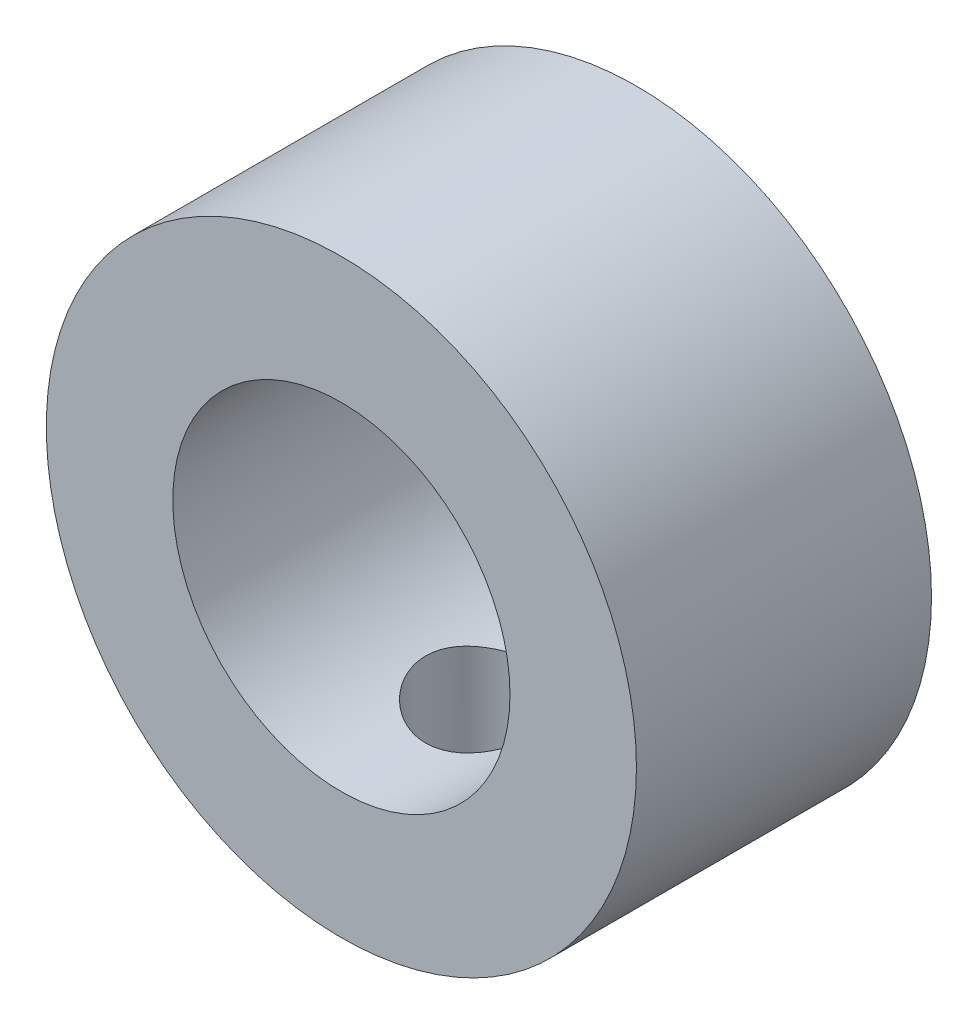
ISO-10303-21;
HEADER;
FILE_DESCRIPTION(('STEP AP214'),'2;1');
FILE_NAME('part.step','',(''),(''),'','','');
FILE_SCHEMA(('AUTOMOTIVE_DESIGN { 1 0 10303 214 1 1 1 1 }'));
ENDSEC;
DATA;
#1=APPLICATION_CONTEXT('core data for automotive mechanical design processes');
#2=APPLICATION_PROTOCOL_DEFINITION('international standard','automotive_design',2000,#1);
#3=PRODUCT_CONTEXT('',#1,'mechanical');
#4=PRODUCT('Part','Part','',(#3));
#5=PRODUCT_RELATED_PRODUCT_CATEGORY('part','',(#4));
#6=PRODUCT_DEFINITION_FORMATION('','',#4);
#7=PRODUCT_DEFINITION_CONTEXT('part definition',#1,'design');
#8=PRODUCT_DEFINITION('design','',#6,#7);
#9=PRODUCT_DEFINITION_SHAPE('','',#8);
#10=(LENGTH_UNIT() NAMED_UNIT(*) SI_UNIT(.MILLI.,.METRE.));
#11=(NAMED_UNIT(*) PLANE_ANGLE_UNIT() SI_UNIT($,.RADIAN.));
#12=(NAMED_UNIT(*) SI_UNIT($,.STERADIAN.) SOLID_ANGLE_UNIT());
#13=UNCERTAINTY_MEASURE_WITH_UNIT(LENGTH_MEASURE(1.E-05),#10,'distance_accuracy_value','');
#14=(GEOMETRIC_REPRESENTATION_CONTEXT(3) GLOBAL_UNCERTAINTY_ASSIGNED_CONTEXT((#13)) GLOBAL_UNIT_ASSIGNED_CONTEXT((#10,
#11,#12)) REPRESENTATION_CONTEXT('',''));
#15=CARTESIAN_POINT('',(0.,0.,0.));
#16=DIRECTION('',(0.,0.,1.));
#17=DIRECTION('',(1.,0.,0.));
#18=AXIS2_PLACEMENT_3D('',#15,#16,#17);
#19=CARTESIAN_POINT('',(0.,0.,7.));
#20=DIRECTION('',(0.,0.,1.));
#21=DIRECTION('',(1.,0.,0.));
#22=AXIS2_PLACEMENT_3D('',#19,#20,#21);
#23=PLANE('',#22);
#24=CARTESIAN_POINT('',(0.,0.,7.));
#25=DIRECTION('',(0.,0.,1.));
#26=DIRECTION('',(1.,0.,0.));
#27=AXIS2_PLACEMENT_3D('',#24,#25,#26);
#28=CIRCLE('',#27,7.);
#29=CARTESIAN_POINT('',(7.,0.,7.));
#30=VERTEX_POINT('',#29);
#31=EDGE_CURVE('E10',#30,#30,#28,.T.);
#32=ORIENTED_EDGE('',*,*,#31,.T.);
#33=EDGE_LOOP('',(#32));
#34=FACE_BOUND('',#33,.T.);
#35=CARTESIAN_POINT('',(0.,0.,7.));
#36=DIRECTION('',(0.,0.,1.));
#37=DIRECTION('',(1.,0.,0.));
#38=AXIS2_PLACEMENT_3D('',#35,#36,#37);
#39=CIRCLE('',#38,4.);
#40=CARTESIAN_POINT('',(4.,0.,7.));
#41=VERTEX_POINT('',#40);
#42=EDGE_CURVE('E48',#41,#41,#39,.T.);
#43=ORIENTED_EDGE('',*,*,#42,.F.);
#44=EDGE_LOOP('',(#43));
#45=FACE_BOUND('',#44,.T.);
#46=ADVANCED_FACE('F31',(#34,#45),#23,.T.);
#47=CARTESIAN_POINT('',(0.,0.,0.));
#48=DIRECTION('',(0.,0.,1.));
#49=DIRECTION('',(1.,0.,0.));
#50=AXIS2_PLACEMENT_3D('',#47,#48,#49);
#51=PLANE('',#50);
#52=CARTESIAN_POINT('',(0.,0.,0.));
#53=DIRECTION('',(0.,0.,1.));
#54=DIRECTION('',(1.,0.,0.));
#55=AXIS2_PLACEMENT_3D('',#52,#53,#54);
#56=CIRCLE('',#55,7.);
#57=CARTESIAN_POINT('',(7.,0.,0.));
#58=VERTEX_POINT('',#57);
#59=EDGE_CURVE('E43',#58,#58,#56,.T.);
#60=ORIENTED_EDGE('',*,*,#59,.F.);
#61=EDGE_LOOP('',(#60));
#62=FACE_BOUND('',#61,.T.);
#63=CARTESIAN_POINT('',(0.,0.,0.));
#64=DIRECTION('',(0.,0.,1.));
#65=DIRECTION('',(1.,0.,0.));
#66=AXIS2_PLACEMENT_3D('',#63,#64,#65);
#67=CIRCLE('',#66,4.);
#68=CARTESIAN_POINT('',(4.,0.,0.));
#69=VERTEX_POINT('',#68);
#70=EDGE_CURVE('E50',#69,#69,#67,.T.);
#71=ORIENTED_EDGE('',*,*,#70,.T.);
#72=EDGE_LOOP('',(#71));
#73=FACE_BOUND('',#72,.T.);
#74=ADVANCED_FACE('F69',(#62,#73),#51,.F.);
#75=CARTESIAN_POINT('',(0.,0.,7.));
#76=DIRECTION('',(0.,0.,-1.));
#77=DIRECTION('',(-1.,0.,0.));
#78=AXIS2_PLACEMENT_3D('',#75,#76,#77);
#79=CYLINDRICAL_SURFACE('',#78,7.);
#80=CARTESIAN_POINT('',(0.,-7.,5.));
#81=CARTESIAN_POINT('',(-0.0832358860906165,-6.99999846043226,4.9999971004257));
#82=CARTESIAN_POINT('',(-0.166507195600274,-6.9985002594971,4.99304839161214));
#83=CARTESIAN_POINT('',(-0.330687344293327,-6.99266829827728,4.96546434314641));
#84=CARTESIAN_POINT('',(-0.41159440357119,-6.98833245637099,4.94481895580507));
#85=CARTESIAN_POINT('',(-0.568649323817736,-6.97730831788827,4.89051563539196));
#86=CARTESIAN_POINT('',(-0.644801963446555,-6.97062242967171,4.85687102061868));
#87=CARTESIAN_POINT('',(-0.790378177960787,-6.95562106817971,4.77756591382874));
#88=CARTESIAN_POINT('',(-0.859801981747369,-6.94730565036661,4.73190583075006));
#89=CARTESIAN_POINT('',(-0.991024790535229,-6.92981369246311,4.62911970032649));
#90=CARTESIAN_POINT('',(-1.05270503419445,-6.92062683143259,4.57184377810147));
#91=CARTESIAN_POINT('',(-1.16566042389435,-6.90250069814144,4.4477736843148));
#92=CARTESIAN_POINT('',(-1.21693467150908,-6.8935614473163,4.38097869174874));
#93=CARTESIAN_POINT('',(-1.30814204379808,-6.87684116047225,4.23889424713957));
#94=CARTESIAN_POINT('',(-1.34794958335009,-6.8690733634436,4.16352248224379));
#95=CARTESIAN_POINT('',(-1.41428823691148,-6.85572325558537,4.00696554623316));
#96=CARTESIAN_POINT('',(-1.44082087001716,-6.85014069470711,3.92578104150743));
#97=CARTESIAN_POINT('',(-1.47946574422454,-6.84189808926311,3.76118891341193));
#98=CARTESIAN_POINT('',(-1.49178779748342,-6.83919556896486,3.67783272433614));
#99=CARTESIAN_POINT('',(-1.50231395206577,-6.83689139845106,3.51019576749301));
#100=CARTESIAN_POINT('',(-1.50051971664629,-6.83728938291729,3.42591510982005));
#101=CARTESIAN_POINT('',(-1.48303326340861,-6.84110276603832,3.26037531206621));
#102=CARTESIAN_POINT('',(-1.46758398649408,-6.84446541682162,3.17908911089985));
#103=CARTESIAN_POINT('',(-1.42361054298677,-6.85374593375788,3.02028975971066));
#104=CARTESIAN_POINT('',(-1.39508566936466,-6.85966393808402,2.94277681396768));
#105=CARTESIAN_POINT('',(-1.32554551075991,-6.87344080755724,2.79303712712666));
#106=CARTESIAN_POINT('',(-1.2844361097283,-6.88131420983365,2.72085548728745));
#107=CARTESIAN_POINT('',(-1.19096007283993,-6.89810572501288,2.58432483504204));
#108=CARTESIAN_POINT('',(-1.13859196103562,-6.90702397481896,2.5199768513138));
#109=CARTESIAN_POINT('',(-1.0227954275532,-6.92512718393878,2.3995406443266));
#110=CARTESIAN_POINT('',(-0.959160233964411,-6.93431383972178,2.34365129341526));
#111=CARTESIAN_POINT('',(-0.823317306269097,-6.95175017497059,2.24330626631034));
#112=CARTESIAN_POINT('',(-0.7511094287754,-6.95999983875972,2.19885078139961));
#113=CARTESIAN_POINT('',(-0.59993346204996,-6.97465778534003,2.12258932009307));
#114=CARTESIAN_POINT('',(-0.520952258863483,-6.98106238643354,2.09080858742202));
#115=CARTESIAN_POINT('',(-0.358603146685707,-6.99128109245334,2.04102435167892));
#116=CARTESIAN_POINT('',(-0.27523585113367,-6.99509555860384,2.02301892743668));
#117=CARTESIAN_POINT('',(-0.10818767083663,-6.99965306347808,2.00158378585658));
#118=CARTESIAN_POINT('',(-0.0245431772716156,-7.00045336521066,1.99788228711822));
#119=CARTESIAN_POINT('',(0.142168973650404,-6.99905248935969,2.00442457112516));
#120=CARTESIAN_POINT('',(0.225236668127254,-6.99685150675698,2.01466744796294));
#121=CARTESIAN_POINT('',(0.387542537982805,-6.98973143045266,2.0485822436617));
#122=CARTESIAN_POINT('',(0.466811712908476,-6.9848410504546,2.07211236947253));
#123=CARTESIAN_POINT('',(0.620278450473417,-6.9728892442151,2.13177694299482));
#124=CARTESIAN_POINT('',(0.694475592587739,-6.96582763822237,2.16791243431165));
#125=CARTESIAN_POINT('',(0.836821397964753,-6.950175043904,2.25233354306033));
#126=CARTESIAN_POINT('',(0.904872575111139,-6.94156431354275,2.30077979490973));
#127=CARTESIAN_POINT('',(1.03197692552359,-6.92381033034847,2.40823482488874));
#128=CARTESIAN_POINT('',(1.09102897869199,-6.91466701142097,2.46724491588744));
#129=CARTESIAN_POINT('',(1.19952711057989,-6.89668172706324,2.59539737018713));
#130=CARTESIAN_POINT('',(1.24878537255156,-6.88784792221285,2.6647000992221));
#131=CARTESIAN_POINT('',(1.3349641538604,-6.87166654559681,2.81075459647799));
#132=CARTESIAN_POINT('',(1.37188519913706,-6.86431891048055,2.88750604697749));
#133=CARTESIAN_POINT('',(1.43209741248548,-6.8520100980739,3.0458722989946));
#134=CARTESIAN_POINT('',(1.45546398641275,-6.84703574582967,3.12745735643067));
#135=CARTESIAN_POINT('',(1.48812696085335,-6.84001186708418,3.29351558383363));
#136=CARTESIAN_POINT('',(1.49742550780258,-6.83796189439706,3.37798831120132));
#137=CARTESIAN_POINT('',(1.5015999992604,-6.83704618848155,3.54553234317524));
#138=CARTESIAN_POINT('',(1.49677347258311,-6.83811476518543,3.62859601498058));
#139=CARTESIAN_POINT('',(1.47349789406331,-6.8431676318483,3.79269724213259));
#140=CARTESIAN_POINT('',(1.45504898957979,-6.84715189026714,3.87373481938657));
#141=CARTESIAN_POINT('',(1.40519345940434,-6.85755581104157,4.03125865786917));
#142=CARTESIAN_POINT('',(1.37382847170887,-6.86396764224703,4.10775864866429));
#143=CARTESIAN_POINT('',(1.29906751595601,-6.87850764590649,4.25445537250685));
#144=CARTESIAN_POINT('',(1.255670353015,-6.88663598880363,4.32465147861504));
#145=CARTESIAN_POINT('',(1.15708290349304,-6.90389055593232,4.45821819372536));
#146=CARTESIAN_POINT('',(1.10167987421237,-6.91303309938926,4.52142969594698));
#147=CARTESIAN_POINT('',(0.981086554619622,-6.93117449799694,4.63775626252046));
#148=CARTESIAN_POINT('',(0.915894009385598,-6.94017331951296,4.6908689943122));
#149=CARTESIAN_POINT('',(0.776603147268718,-6.95714491048987,4.78611595950556));
#150=CARTESIAN_POINT('',(0.702404846009643,-6.96510364570626,4.82810660623098));
#151=CARTESIAN_POINT('',(0.5478501609406,-6.97895826104019,4.89895452890618));
#152=CARTESIAN_POINT('',(0.467499105863881,-6.98485590212343,4.92782302258503));
#153=CARTESIAN_POINT('',(0.322535217553205,-6.99284848461772,4.96635218513115));
#154=CARTESIAN_POINT('',(0.25871720554598,-6.99551391888263,4.97894643398003));
#155=CARTESIAN_POINT('',(0.129939960853847,-6.99909024154719,4.99577130171167));
#156=CARTESIAN_POINT('',(0.0649807750887452,-7.00000120191314,5.00000226364606));
#157=CARTESIAN_POINT('',(0.,-7.,5.));
#158=B_SPLINE_CURVE_WITH_KNOTS('',3,(#80,#81,#82,#83,#84,#85,#86,#87,#88,#89,#90,#91,#92,#93,
#94,#95,#96,#97,#98,#99,#100,#101,#102,#103,#104,#105,#106,#107,#108,#109,#110,#111,#112,#113,
#114,#115,#116,#117,#118,#119,#120,#121,#122,#123,#124,#125,#126,#127,#128,#129,#130,#131,#132,
#133,#134,#135,#136,#137,#138,#139,#140,#141,#142,#143,#144,#145,#146,#147,#148,#149,#150,#151,
#152,#153,#154,#155,#156,#157),.UNSPECIFIED.,.T.,.F.,(4,2,2,2,2,2,2,2,2,2,2,2,2,2,2,2,2,2,2,2,2,
2,2,2,2,2,2,2,2,2,2,2,2,2,2,2,2,2,4),(0.,0.249469836512082,0.499122883219935,0.748520824425601,
0.997910278645886,1.25074961881732,1.50361077918506,1.7591442921451,2.0146485567749,
2.26633008124666,2.51798195169165,2.76524475452927,3.01252092904568,3.26169356165968,
3.51089887920889,3.76527011050291,4.0196455970235,4.27452521139806,4.52936927256343,
4.77934665704185,5.02930780231429,5.27665060589267,5.52401389198434,5.77478733867803,
6.02559197304485,6.28082063283534,6.53603841075805,6.78982240408475,7.04356767229185,
7.29200680540294,7.5404432510827,7.78808499706785,8.03575134451623,8.28822950154114,
8.54076590397115,8.79641910357222,9.05185334010271,9.24661799132294,9.44137465337336),.UNSPECIFIED.);
#159=CARTESIAN_POINT('',(0.,-7.,5.));
#160=VERTEX_POINT('',#159);
#161=EDGE_CURVE('E55',#160,#160,#158,.T.);
#162=ORIENTED_EDGE('',*,*,#161,.F.);
#163=EDGE_LOOP('',(#162));
#164=FACE_BOUND('',#163,.T.);
#165=ORIENTED_EDGE('',*,*,#31,.F.);
#166=EDGE_LOOP('',(#165));
#167=FACE_BOUND('',#166,.T.);
#168=ORIENTED_EDGE('',*,*,#59,.T.);
#169=EDGE_LOOP('',(#168));
#170=FACE_BOUND('',#169,.T.);
#171=ADVANCED_FACE('F33',(#164,#167,#170),#79,.T.);
#172=CARTESIAN_POINT('',(0.,0.,7.));
#173=DIRECTION('',(0.,0.,-1.));
#174=DIRECTION('',(-1.,0.,0.));
#175=AXIS2_PLACEMENT_3D('',#172,#173,#174);
#176=CYLINDRICAL_SURFACE('',#175,4.);
#177=CARTESIAN_POINT('',(0.,-4.,5.));
#178=CARTESIAN_POINT('',(0.081235058937853,-4.00000217456151,5.00000290230311));
#179=CARTESIAN_POINT('',(0.162450241781792,-3.99750379283184,4.99338023975162));
#180=CARTESIAN_POINT('',(0.322453452352361,-3.98778696006928,4.96717180473007));
#181=CARTESIAN_POINT('',(0.401241827987616,-3.98056918893993,4.94758789952943));
#182=CARTESIAN_POINT('',(0.554060784990879,-3.96218832391545,4.89624699822824));
#183=CARTESIAN_POINT('',(0.628100224162277,-3.9510328434944,4.86451348317821));
#184=CARTESIAN_POINT('',(0.769799310160253,-3.92588767765353,4.78989358698418));
#185=CARTESIAN_POINT('',(0.837457239177879,-3.91189723227548,4.74700421445584));
#186=CARTESIAN_POINT('',(0.967346417045826,-3.88186246971217,4.64938746892909));
#187=CARTESIAN_POINT('',(1.02927073015119,-3.86576002583566,4.5942697377406));
#188=CARTESIAN_POINT('',(1.14324421474363,-3.83360220871327,4.47458956534116));
#189=CARTESIAN_POINT('',(1.19529036359203,-3.81754685135033,4.41002424391213));
#190=CARTESIAN_POINT('',(1.28998202215985,-3.78662470617731,4.27028253247679));
#191=CARTESIAN_POINT('',(1.3321939319576,-3.77182648820818,4.19479563345418));
#192=CARTESIAN_POINT('',(1.40318646334084,-3.74599860237433,4.03715164583148));
#193=CARTESIAN_POINT('',(1.43197244961239,-3.73496742975881,3.9549972368449));
#194=CARTESIAN_POINT('',(1.47408431017549,-3.71854412824136,3.7898832597418));
#195=CARTESIAN_POINT('',(1.48799593218558,-3.71293924350838,3.70709496156456));
#196=CARTESIAN_POINT('',(1.50179556531648,-3.70738061461215,3.54018384200616));
#197=CARTESIAN_POINT('',(1.5016893680263,-3.70742453659305,3.45606158612553));
#198=CARTESIAN_POINT('',(1.48790429610018,-3.71297511632055,3.29423047478704));
#199=CARTESIAN_POINT('',(1.47503808509003,-3.71815468871122,3.21643909395582));
#200=CARTESIAN_POINT('',(1.4374416786833,-3.73284938059529,3.06421284959468));
#201=CARTESIAN_POINT('',(1.41270969663258,-3.74236515298863,2.98977849338612));
#202=CARTESIAN_POINT('',(1.35163748571904,-3.76485702190253,2.84472293227177));
#203=CARTESIAN_POINT('',(1.31508648737101,-3.77789517988166,2.7742005138787));
#204=CARTESIAN_POINT('',(1.23156073762698,-3.80594210139319,2.64005426240903));
#205=CARTESIAN_POINT('',(1.18458238728897,-3.82095154457158,2.5764328224803));
#206=CARTESIAN_POINT('',(1.07781780766549,-3.85248038859113,2.45339633634912));
#207=CARTESIAN_POINT('',(1.01738298716955,-3.86903347455671,2.39455135925191));
#208=CARTESIAN_POINT('',(0.88731259081902,-3.90091728164085,2.2876620337942));
#209=CARTESIAN_POINT('',(0.817675603497363,-3.91624781465952,2.23961934539433));
#210=CARTESIAN_POINT('',(0.669723436992419,-3.9442639480908,2.15506960293748));
#211=CARTESIAN_POINT('',(0.591290713844719,-3.95690498259616,2.11875241877894));
#212=CARTESIAN_POINT('',(0.428836850524583,-3.97778718326962,2.06001739572996));
#213=CARTESIAN_POINT('',(0.344818210845767,-3.98603030341493,2.03759338343888));
#214=CARTESIAN_POINT('',(0.178375243148665,-3.99684443228065,2.00837721245806));
#215=CARTESIAN_POINT('',(0.0961036195622095,-3.99969369025686,2.00081739361749));
#216=CARTESIAN_POINT('',(-0.0685724752550241,-4.00025893700126,1.99930893610008));
#217=CARTESIAN_POINT('',(-0.150976912983373,-3.99797606386863,2.00535727968322));
#218=CARTESIAN_POINT('',(-0.310262048561859,-3.98871709772643,2.03031004230867));
#219=CARTESIAN_POINT('',(-0.387233328007336,-3.98192470962305,2.04871154373708));
#220=CARTESIAN_POINT('',(-0.536941754957221,-3.96451477091717,2.09718607254732));
#221=CARTESIAN_POINT('',(-0.609678350347534,-3.9538967228203,2.12726061794804));
#222=CARTESIAN_POINT('',(-0.751247765110155,-3.92949624407681,2.19918641243948));
#223=CARTESIAN_POINT('',(-0.819903083557795,-3.91563000209348,2.24135772922339));
#224=CARTESIAN_POINT('',(-0.949392711726625,-3.88626671564664,2.33591810317156));
#225=CARTESIAN_POINT('',(-1.01022412027045,-3.87076907009516,2.38831093254515));
#226=CARTESIAN_POINT('',(-1.12603079874454,-3.8387332949099,2.50540412212427));
#227=CARTESIAN_POINT('',(-1.18046154123569,-3.82218696503729,2.5706421827727));
#228=CARTESIAN_POINT('',(-1.27771050031903,-3.79078815746854,2.70965138470766));
#229=CARTESIAN_POINT('',(-1.32052767414518,-3.77593583194399,2.7834232913885));
#230=CARTESIAN_POINT('',(-1.39337773518998,-3.74966829822463,2.93801598677231));
#231=CARTESIAN_POINT('',(-1.42335685446918,-3.73826760328493,3.01886474591044));
#232=CARTESIAN_POINT('',(-1.46907883466889,-3.72054032891005,3.18500976368782));
#233=CARTESIAN_POINT('',(-1.48483050305535,-3.71421061057491,3.27030323619812));
#234=CARTESIAN_POINT('',(-1.50086347097839,-3.70775894792573,3.43701615954111));
#235=CARTESIAN_POINT('',(-1.50207331495837,-3.70726444523341,3.51833263171689));
#236=CARTESIAN_POINT('',(-1.49136715641593,-3.71158412745292,3.67994531627617));
#237=CARTESIAN_POINT('',(-1.47945239850124,-3.71639780898899,3.76024162467158));
#238=CARTESIAN_POINT('',(-1.44355815630242,-3.73048141585432,3.91504722671655));
#239=CARTESIAN_POINT('',(-1.41995798316524,-3.73961085376663,3.98965834624534));
#240=CARTESIAN_POINT('',(-1.3616969677992,-3.76121548297845,4.13390550849442));
#241=CARTESIAN_POINT('',(-1.32703332944945,-3.77369151995215,4.20354028807014));
#242=CARTESIAN_POINT('',(-1.24552075938154,-3.80139723903965,4.33982678969763));
#243=CARTESIAN_POINT('',(-1.1981283280301,-3.81673698440964,4.40613079679991));
#244=CARTESIAN_POINT('',(-1.09334485729906,-3.84806246757177,4.5301415609712));
#245=CARTESIAN_POINT('',(-1.03595064012808,-3.86404840943145,4.58784557478675));
#246=CARTESIAN_POINT('',(-0.909080396784623,-3.89590424609881,4.69620195582184));
#247=CARTESIAN_POINT('',(-0.839118644212992,-3.91172104900645,4.74630375343467));
#248=CARTESIAN_POINT('',(-0.691213223200821,-3.94054514457031,4.83402265527656));
#249=CARTESIAN_POINT('',(-0.613268934090621,-3.95355221851559,4.87163878773637));
#250=CARTESIAN_POINT('',(-0.447999082002312,-3.9757429260668,4.93437682904833));
#251=CARTESIAN_POINT('',(-0.360413422234208,-3.98473657158356,4.9588870646019));
#252=CARTESIAN_POINT('',(-0.181875733606382,-3.99686242179587,4.99169295992068));
#253=CARTESIAN_POINT('',(-0.090925416364859,-3.99999756603967,4.99999675148732));
#254=CARTESIAN_POINT('',(0.,-4.,5.));
#255=B_SPLINE_CURVE_WITH_KNOTS('',3,(#177,#178,#179,#180,#181,#182,#183,#184,#185,#186,#187,
#188,#189,#190,#191,#192,#193,#194,#195,#196,#197,#198,#199,#200,#201,#202,#203,#204,#205,#206,
#207,#208,#209,#210,#211,#212,#213,#214,#215,#216,#217,#218,#219,#220,#221,#222,#223,#224,#225,
#226,#227,#228,#229,#230,#231,#232,#233,#234,#235,#236,#237,#238,#239,#240,#241,#242,#243,#244,
#245,#246,#247,#248,#249,#250,#251,#252,#253,#254),.UNSPECIFIED.,.T.,.F.,(4,2,2,2,2,2,2,2,2,2,2,
2,2,2,2,2,2,2,2,2,2,2,2,2,2,2,2,2,2,2,2,2,2,2,2,2,2,2,4),(0.,0.24336980156056,0.48670454953046,
0.729571369213573,0.97250337960949,1.22473618582715,1.47704604925622,1.73896674501659,
2.00078269352134,2.25185874416901,2.50283106079707,2.73878345119971,2.97477138060589,
3.21522408387018,3.45575990744258,3.71246153335813,3.96920257905066,4.22991375286075,
4.49050899698846,4.73725019635925,4.98393668390521,5.2211443792384,5.45838293254454,
5.702592218596,5.94689180019868,6.20536519455658,6.46386178920141,6.72343066727204,
6.98283874956507,7.22558763480252,7.46831350211259,7.70363142426533,7.93900886656507,
8.18672471884271,8.43451941997062,8.69572329654039,8.95694749805102,9.22948515032042,
9.50188601796128),.UNSPECIFIED.);
#256=CARTESIAN_POINT('',(0.,-4.,5.));
#257=VERTEX_POINT('',#256);
#258=EDGE_CURVE('E35',#257,#257,#255,.T.);
#259=ORIENTED_EDGE('',*,*,#258,.F.);
#260=EDGE_LOOP('',(#259));
#261=FACE_BOUND('',#260,.T.);
#262=ORIENTED_EDGE('',*,*,#42,.T.);
#263=EDGE_LOOP('',(#262));
#264=FACE_BOUND('',#263,.T.);
#265=ORIENTED_EDGE('',*,*,#70,.F.);
#266=EDGE_LOOP('',(#265));
#267=FACE_BOUND('',#266,.T.);
#268=ADVANCED_FACE('F63',(#261,#264,#267),#176,.F.);
#269=CARTESIAN_POINT('',(0.,-7.001,3.5));
#270=DIRECTION('',(0.,1.,0.));
#271=DIRECTION('',(0.,0.,1.));
#272=AXIS2_PLACEMENT_3D('',#269,#270,#271);
#273=CYLINDRICAL_SURFACE('',#272,1.5);
#274=ORIENTED_EDGE('',*,*,#258,.T.);
#275=EDGE_LOOP('',(#274));
#276=FACE_BOUND('',#275,.T.);
#277=ORIENTED_EDGE('',*,*,#161,.T.);
#278=EDGE_LOOP('',(#277));
#279=FACE_BOUND('',#278,.T.);
#280=ADVANCED_FACE('F60',(#276,#279),#273,.F.);
#281=CLOSED_SHELL('',(#46,#74,#171,#268,#280));
#282=MANIFOLD_SOLID_BREP('B2',#281);
#283=ADVANCED_BREP_SHAPE_REPRESENTATION('',(#18,#282),#14);
#284=SHAPE_DEFINITION_REPRESENTATION(#9,#283);
ENDSEC;
END-ISO-10303-21;
